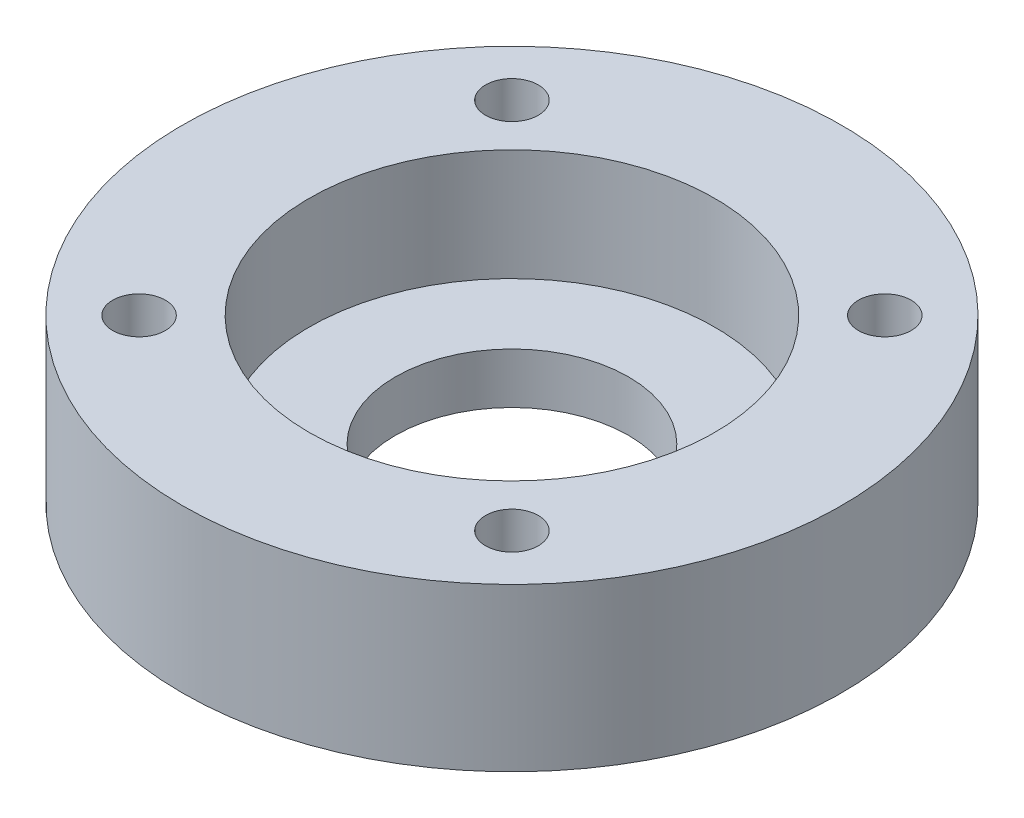
ISO-10303-21;
HEADER;
FILE_DESCRIPTION(('STEP AP214'),'2;1');
FILE_NAME('part.step','',(''),(''),'','','');
FILE_SCHEMA(('AUTOMOTIVE_DESIGN { 1 0 10303 214 1 1 1 1 }'));
ENDSEC;
DATA;
#1=APPLICATION_CONTEXT('core data for automotive mechanical design processes');
#2=APPLICATION_PROTOCOL_DEFINITION('international standard','automotive_design',2000,#1);
#3=PRODUCT_CONTEXT('',#1,'mechanical');
#4=PRODUCT('Part','Part','',(#3));
#5=PRODUCT_RELATED_PRODUCT_CATEGORY('part','',(#4));
#6=PRODUCT_DEFINITION_FORMATION('','',#4);
#7=PRODUCT_DEFINITION_CONTEXT('part definition',#1,'design');
#8=PRODUCT_DEFINITION('design','',#6,#7);
#9=PRODUCT_DEFINITION_SHAPE('','',#8);
#10=(LENGTH_UNIT() NAMED_UNIT(*) SI_UNIT(.MILLI.,.METRE.));
#11=(NAMED_UNIT(*) PLANE_ANGLE_UNIT() SI_UNIT($,.RADIAN.));
#12=(NAMED_UNIT(*) SI_UNIT($,.STERADIAN.) SOLID_ANGLE_UNIT());
#13=UNCERTAINTY_MEASURE_WITH_UNIT(LENGTH_MEASURE(1.E-05),#10,'distance_accuracy_value','');
#14=(GEOMETRIC_REPRESENTATION_CONTEXT(3) GLOBAL_UNCERTAINTY_ASSIGNED_CONTEXT((#13)) GLOBAL_UNIT_ASSIGNED_CONTEXT((#10,
#11,#12)) REPRESENTATION_CONTEXT('',''));
#15=CARTESIAN_POINT('',(0.,0.,0.));
#16=DIRECTION('',(0.,0.,1.));
#17=DIRECTION('',(1.,0.,0.));
#18=AXIS2_PLACEMENT_3D('',#15,#16,#17);
#19=CARTESIAN_POINT('',(0.,16.,0.));
#20=DIRECTION('',(0.,-1.,0.));
#21=DIRECTION('',(0.,0.,-1.));
#22=AXIS2_PLACEMENT_3D('',#19,#20,#21);
#23=CYLINDRICAL_SURFACE('',#22,11.5);
#24=CARTESIAN_POINT('',(0.,0.,0.));
#25=DIRECTION('',(0.,1.,0.));
#26=DIRECTION('',(0.,0.,1.));
#27=AXIS2_PLACEMENT_3D('',#24,#25,#26);
#28=CIRCLE('',#27,11.5);
#29=CARTESIAN_POINT('',(0.,0.,11.5));
#30=VERTEX_POINT('',#29);
#31=EDGE_CURVE('E44',#30,#30,#28,.T.);
#32=ORIENTED_EDGE('',*,*,#31,.F.);
#33=EDGE_LOOP('',(#32));
#34=FACE_BOUND('',#33,.T.);
#35=CARTESIAN_POINT('',(0.,5.,0.));
#36=DIRECTION('',(0.,1.,0.));
#37=DIRECTION('',(0.,0.,1.));
#38=AXIS2_PLACEMENT_3D('',#35,#36,#37);
#39=CIRCLE('',#38,11.5);
#40=CARTESIAN_POINT('',(0.,5.,11.5));
#41=VERTEX_POINT('',#40);
#42=EDGE_CURVE('E35',#41,#41,#39,.T.);
#43=ORIENTED_EDGE('',*,*,#42,.T.);
#44=EDGE_LOOP('',(#43));
#45=FACE_BOUND('',#44,.T.);
#46=ADVANCED_FACE('F31',(#34,#45),#23,.F.);
#47=CARTESIAN_POINT('',(0.,16.,0.));
#48=DIRECTION('',(0.,1.,0.));
#49=DIRECTION('',(0.,0.,1.));
#50=AXIS2_PLACEMENT_3D('',#47,#48,#49);
#51=PLANE('',#50);
#52=CARTESIAN_POINT('',(0.,16.,0.));
#53=DIRECTION('',(0.,1.,0.));
#54=DIRECTION('',(0.,0.,1.));
#55=AXIS2_PLACEMENT_3D('',#52,#53,#54);
#56=CIRCLE('',#55,20.);
#57=CARTESIAN_POINT('',(0.,16.,20.));
#58=VERTEX_POINT('',#57);
#59=EDGE_CURVE('E72',#58,#58,#56,.T.);
#60=ORIENTED_EDGE('',*,*,#59,.F.);
#61=EDGE_LOOP('',(#60));
#62=FACE_BOUND('',#61,.T.);
#63=CARTESIAN_POINT('',(-18.3847763108502,16.,-18.3847763108502));
#64=DIRECTION('',(0.,1.,0.));
#65=DIRECTION('',(0.,0.,1.));
#66=AXIS2_PLACEMENT_3D('',#63,#64,#65);
#67=CIRCLE('',#66,2.6);
#68=CARTESIAN_POINT('',(-18.3847763108502,16.,-15.7847763108502));
#69=VERTEX_POINT('',#68);
#70=EDGE_CURVE('E58',#69,#69,#67,.T.);
#71=ORIENTED_EDGE('',*,*,#70,.F.);
#72=EDGE_LOOP('',(#71));
#73=FACE_BOUND('',#72,.T.);
#74=CARTESIAN_POINT('',(18.3847763108502,16.,18.3847763108502));
#75=DIRECTION('',(0.,1.,0.));
#76=DIRECTION('',(0.,0.,1.));
#77=AXIS2_PLACEMENT_3D('',#74,#75,#76);
#78=CIRCLE('',#77,2.6);
#79=CARTESIAN_POINT('',(18.3847763108502,16.,20.9847763108502));
#80=VERTEX_POINT('',#79);
#81=EDGE_CURVE('E48',#80,#80,#78,.T.);
#82=ORIENTED_EDGE('',*,*,#81,.F.);
#83=EDGE_LOOP('',(#82));
#84=FACE_BOUND('',#83,.T.);
#85=CARTESIAN_POINT('',(0.,16.,0.));
#86=DIRECTION('',(0.,1.,0.));
#87=DIRECTION('',(0.,0.,1.));
#88=AXIS2_PLACEMENT_3D('',#85,#86,#87);
#89=CIRCLE('',#88,32.5);
#90=CARTESIAN_POINT('',(0.,16.,32.5));
#91=VERTEX_POINT('',#90);
#92=EDGE_CURVE('E10',#91,#91,#89,.T.);
#93=ORIENTED_EDGE('',*,*,#92,.T.);
#94=EDGE_LOOP('',(#93));
#95=FACE_BOUND('',#94,.T.);
#96=CARTESIAN_POINT('',(-18.3847763108502,16.,18.3847763108502));
#97=DIRECTION('',(0.,1.,0.));
#98=DIRECTION('',(0.,0.,1.));
#99=AXIS2_PLACEMENT_3D('',#96,#97,#98);
#100=CIRCLE('',#99,2.6);
#101=CARTESIAN_POINT('',(-18.3847763108502,16.,20.9847763108502));
#102=VERTEX_POINT('',#101);
#103=EDGE_CURVE('E52',#102,#102,#100,.T.);
#104=ORIENTED_EDGE('',*,*,#103,.F.);
#105=EDGE_LOOP('',(#104));
#106=FACE_BOUND('',#105,.T.);
#107=CARTESIAN_POINT('',(18.3847763108502,16.,-18.3847763108502));
#108=DIRECTION('',(0.,1.,0.));
#109=DIRECTION('',(0.,0.,1.));
#110=AXIS2_PLACEMENT_3D('',#107,#108,#109);
#111=CIRCLE('',#110,2.6);
#112=CARTESIAN_POINT('',(18.3847763108502,16.,-15.7847763108502));
#113=VERTEX_POINT('',#112);
#114=EDGE_CURVE('E64',#113,#113,#111,.T.);
#115=ORIENTED_EDGE('',*,*,#114,.F.);
#116=EDGE_LOOP('',(#115));
#117=FACE_BOUND('',#116,.T.);
#118=ADVANCED_FACE('F94',(#62,#73,#84,#95,#106,#117),#51,.T.);
#119=CARTESIAN_POINT('',(0.,0.,0.));
#120=DIRECTION('',(0.,1.,0.));
#121=DIRECTION('',(0.,0.,1.));
#122=AXIS2_PLACEMENT_3D('',#119,#120,#121);
#123=PLANE('',#122);
#124=CARTESIAN_POINT('',(-18.3847763108502,0.,-18.3847763108502));
#125=DIRECTION('',(0.,1.,0.));
#126=DIRECTION('',(0.,0.,1.));
#127=AXIS2_PLACEMENT_3D('',#124,#125,#126);
#128=CIRCLE('',#127,2.6);
#129=CARTESIAN_POINT('',(-18.3847763108502,0.,-15.7847763108502));
#130=VERTEX_POINT('',#129);
#131=EDGE_CURVE('E61',#130,#130,#128,.T.);
#132=ORIENTED_EDGE('',*,*,#131,.T.);
#133=EDGE_LOOP('',(#132));
#134=FACE_BOUND('',#133,.T.);
#135=CARTESIAN_POINT('',(18.3847763108502,0.,18.3847763108502));
#136=DIRECTION('',(0.,1.,0.));
#137=DIRECTION('',(0.,0.,1.));
#138=AXIS2_PLACEMENT_3D('',#135,#136,#137);
#139=CIRCLE('',#138,2.6);
#140=CARTESIAN_POINT('',(18.3847763108502,0.,20.9847763108502));
#141=VERTEX_POINT('',#140);
#142=EDGE_CURVE('E49',#141,#141,#139,.T.);
#143=ORIENTED_EDGE('',*,*,#142,.T.);
#144=EDGE_LOOP('',(#143));
#145=FACE_BOUND('',#144,.T.);
#146=CARTESIAN_POINT('',(0.,0.,0.));
#147=DIRECTION('',(0.,1.,0.));
#148=DIRECTION('',(0.,0.,1.));
#149=AXIS2_PLACEMENT_3D('',#146,#147,#148);
#150=CIRCLE('',#149,32.5);
#151=CARTESIAN_POINT('',(0.,0.,32.5));
#152=VERTEX_POINT('',#151);
#153=EDGE_CURVE('E39',#152,#152,#150,.T.);
#154=ORIENTED_EDGE('',*,*,#153,.F.);
#155=EDGE_LOOP('',(#154));
#156=FACE_BOUND('',#155,.T.);
#157=ORIENTED_EDGE('',*,*,#31,.T.);
#158=EDGE_LOOP('',(#157));
#159=FACE_BOUND('',#158,.T.);
#160=CARTESIAN_POINT('',(-18.3847763108502,0.,18.3847763108502));
#161=DIRECTION('',(0.,1.,0.));
#162=DIRECTION('',(0.,0.,1.));
#163=AXIS2_PLACEMENT_3D('',#160,#161,#162);
#164=CIRCLE('',#163,2.6);
#165=CARTESIAN_POINT('',(-18.3847763108502,0.,20.9847763108502));
#166=VERTEX_POINT('',#165);
#167=EDGE_CURVE('E55',#166,#166,#164,.T.);
#168=ORIENTED_EDGE('',*,*,#167,.T.);
#169=EDGE_LOOP('',(#168));
#170=FACE_BOUND('',#169,.T.);
#171=CARTESIAN_POINT('',(18.3847763108502,0.,-18.3847763108502));
#172=DIRECTION('',(0.,1.,0.));
#173=DIRECTION('',(0.,0.,1.));
#174=AXIS2_PLACEMENT_3D('',#171,#172,#173);
#175=CIRCLE('',#174,2.6);
#176=CARTESIAN_POINT('',(18.3847763108502,0.,-15.7847763108502));
#177=VERTEX_POINT('',#176);
#178=EDGE_CURVE('E67',#177,#177,#175,.T.);
#179=ORIENTED_EDGE('',*,*,#178,.T.);
#180=EDGE_LOOP('',(#179));
#181=FACE_BOUND('',#180,.T.);
#182=ADVANCED_FACE('F100',(#134,#145,#156,#159,#170,#181),#123,.F.);
#183=CARTESIAN_POINT('',(0.,16.,0.));
#184=DIRECTION('',(0.,-1.,0.));
#185=DIRECTION('',(0.,0.,-1.));
#186=AXIS2_PLACEMENT_3D('',#183,#184,#185);
#187=CYLINDRICAL_SURFACE('',#186,32.5);
#188=ORIENTED_EDGE('',*,*,#92,.F.);
#189=EDGE_LOOP('',(#188));
#190=FACE_BOUND('',#189,.T.);
#191=ORIENTED_EDGE('',*,*,#153,.T.);
#192=EDGE_LOOP('',(#191));
#193=FACE_BOUND('',#192,.T.);
#194=ADVANCED_FACE('F33',(#190,#193),#187,.T.);
#195=CARTESIAN_POINT('',(18.3847763108502,16.,18.3847763108502));
#196=DIRECTION('',(0.,-1.,0.));
#197=DIRECTION('',(0.,0.,-1.));
#198=AXIS2_PLACEMENT_3D('',#195,#196,#197);
#199=CYLINDRICAL_SURFACE('',#198,2.6);
#200=ORIENTED_EDGE('',*,*,#81,.T.);
#201=EDGE_LOOP('',(#200));
#202=FACE_BOUND('',#201,.T.);
#203=ORIENTED_EDGE('',*,*,#142,.F.);
#204=EDGE_LOOP('',(#203));
#205=FACE_BOUND('',#204,.T.);
#206=ADVANCED_FACE('F105',(#202,#205),#199,.F.);
#207=CARTESIAN_POINT('',(-18.3847763108502,16.,18.3847763108502));
#208=DIRECTION('',(0.,-1.,0.));
#209=DIRECTION('',(0.,0.,-1.));
#210=AXIS2_PLACEMENT_3D('',#207,#208,#209);
#211=CYLINDRICAL_SURFACE('',#210,2.6);
#212=ORIENTED_EDGE('',*,*,#103,.T.);
#213=EDGE_LOOP('',(#212));
#214=FACE_BOUND('',#213,.T.);
#215=ORIENTED_EDGE('',*,*,#167,.F.);
#216=EDGE_LOOP('',(#215));
#217=FACE_BOUND('',#216,.T.);
#218=ADVANCED_FACE('F131',(#214,#217),#211,.F.);
#219=CARTESIAN_POINT('',(-18.3847763108502,16.,-18.3847763108502));
#220=DIRECTION('',(0.,-1.,0.));
#221=DIRECTION('',(0.,0.,-1.));
#222=AXIS2_PLACEMENT_3D('',#219,#220,#221);
#223=CYLINDRICAL_SURFACE('',#222,2.6);
#224=ORIENTED_EDGE('',*,*,#70,.T.);
#225=EDGE_LOOP('',(#224));
#226=FACE_BOUND('',#225,.T.);
#227=ORIENTED_EDGE('',*,*,#131,.F.);
#228=EDGE_LOOP('',(#227));
#229=FACE_BOUND('',#228,.T.);
#230=ADVANCED_FACE('F125',(#226,#229),#223,.F.);
#231=CARTESIAN_POINT('',(18.3847763108502,16.,-18.3847763108502));
#232=DIRECTION('',(0.,-1.,0.));
#233=DIRECTION('',(0.,0.,-1.));
#234=AXIS2_PLACEMENT_3D('',#231,#232,#233);
#235=CYLINDRICAL_SURFACE('',#234,2.6);
#236=ORIENTED_EDGE('',*,*,#114,.T.);
#237=EDGE_LOOP('',(#236));
#238=FACE_BOUND('',#237,.T.);
#239=ORIENTED_EDGE('',*,*,#178,.F.);
#240=EDGE_LOOP('',(#239));
#241=FACE_BOUND('',#240,.T.);
#242=ADVANCED_FACE('F90',(#238,#241),#235,.F.);
#243=CARTESIAN_POINT('',(0.,5.,0.));
#244=DIRECTION('',(0.,1.,0.));
#245=DIRECTION('',(0.,0.,1.));
#246=AXIS2_PLACEMENT_3D('',#243,#244,#245);
#247=CYLINDRICAL_SURFACE('',#246,20.);
#248=CARTESIAN_POINT('',(0.,5.,0.));
#249=DIRECTION('',(0.,1.,0.));
#250=DIRECTION('',(0.,0.,1.));
#251=AXIS2_PLACEMENT_3D('',#248,#249,#250);
#252=CIRCLE('',#251,20.);
#253=CARTESIAN_POINT('',(0.,5.,20.));
#254=VERTEX_POINT('',#253);
#255=EDGE_CURVE('E75',#254,#254,#252,.T.);
#256=ORIENTED_EDGE('',*,*,#255,.F.);
#257=EDGE_LOOP('',(#256));
#258=FACE_BOUND('',#257,.T.);
#259=ORIENTED_EDGE('',*,*,#59,.T.);
#260=EDGE_LOOP('',(#259));
#261=FACE_BOUND('',#260,.T.);
#262=ADVANCED_FACE('F85',(#258,#261),#247,.F.);
#263=CARTESIAN_POINT('',(0.,5.,0.));
#264=DIRECTION('',(0.,1.,0.));
#265=DIRECTION('',(0.,0.,1.));
#266=AXIS2_PLACEMENT_3D('',#263,#264,#265);
#267=PLANE('',#266);
#268=ORIENTED_EDGE('',*,*,#42,.F.);
#269=EDGE_LOOP('',(#268));
#270=FACE_BOUND('',#269,.T.);
#271=ORIENTED_EDGE('',*,*,#255,.T.);
#272=EDGE_LOOP('',(#271));
#273=FACE_BOUND('',#272,.T.);
#274=ADVANCED_FACE('F83',(#270,#273),#267,.T.);
#275=CLOSED_SHELL('',(#46,#118,#182,#194,#206,#218,#230,#242,#262,#274));
#276=MANIFOLD_SOLID_BREP('B2',#275);
#277=ADVANCED_BREP_SHAPE_REPRESENTATION('',(#18,#276),#14);
#278=SHAPE_DEFINITION_REPRESENTATION(#9,#277);
ENDSEC;
END-ISO-10303-21;
